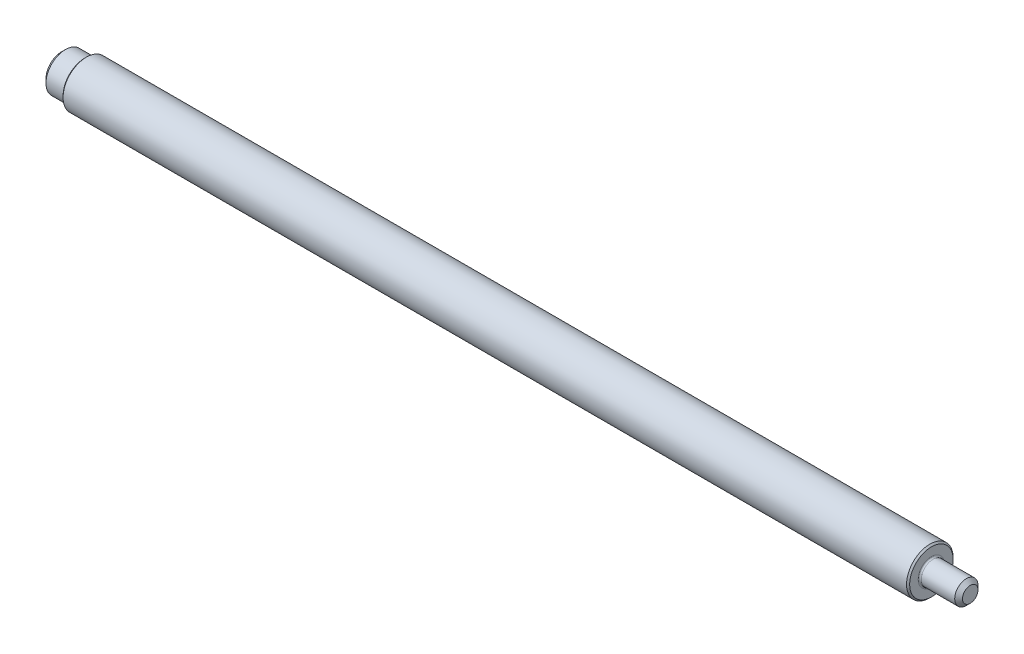
ISO-10303-21;
HEADER;
FILE_DESCRIPTION(('STEP AP214'),'2;1');
FILE_NAME('part.step','',(''),(''),'','','');
FILE_SCHEMA(('AUTOMOTIVE_DESIGN { 1 0 10303 214 1 1 1 1 }'));
ENDSEC;
DATA;
#1=APPLICATION_CONTEXT('core data for automotive mechanical design processes');
#2=APPLICATION_PROTOCOL_DEFINITION('international standard','automotive_design',2000,#1);
#3=PRODUCT_CONTEXT('',#1,'mechanical');
#4=PRODUCT('Part','Part','',(#3));
#5=PRODUCT_RELATED_PRODUCT_CATEGORY('part','',(#4));
#6=PRODUCT_DEFINITION_FORMATION('','',#4);
#7=PRODUCT_DEFINITION_CONTEXT('part definition',#1,'design');
#8=PRODUCT_DEFINITION('design','',#6,#7);
#9=PRODUCT_DEFINITION_SHAPE('','',#8);
#10=(LENGTH_UNIT() NAMED_UNIT(*) SI_UNIT(.MILLI.,.METRE.));
#11=(NAMED_UNIT(*) PLANE_ANGLE_UNIT() SI_UNIT($,.RADIAN.));
#12=(NAMED_UNIT(*) SI_UNIT($,.STERADIAN.) SOLID_ANGLE_UNIT());
#13=UNCERTAINTY_MEASURE_WITH_UNIT(LENGTH_MEASURE(1.E-05),#10,'distance_accuracy_value','');
#14=(GEOMETRIC_REPRESENTATION_CONTEXT(3) GLOBAL_UNCERTAINTY_ASSIGNED_CONTEXT((#13)) GLOBAL_UNIT_ASSIGNED_CONTEXT((#10,
#11,#12)) REPRESENTATION_CONTEXT('',''));
#15=CARTESIAN_POINT('',(0.,0.,0.));
#16=DIRECTION('',(0.,0.,1.));
#17=DIRECTION('',(1.,0.,0.));
#18=AXIS2_PLACEMENT_3D('',#15,#16,#17);
#19=CARTESIAN_POINT('',(117.,1.5,0.));
#20=DIRECTION('',(-1.,0.,0.));
#21=DIRECTION('',(0.,0.,1.));
#22=AXIS2_PLACEMENT_3D('',#19,#20,#21);
#23=PLANE('',#22);
#24=CARTESIAN_POINT('',(117.,0.,0.));
#25=DIRECTION('',(-1.,0.,0.));
#26=DIRECTION('',(0.,0.,1.));
#27=AXIS2_PLACEMENT_3D('',#24,#25,#26);
#28=CIRCLE('',#27,0.999999999999987);
#29=CARTESIAN_POINT('',(117.,0.,0.999999999999987));
#30=VERTEX_POINT('',#29);
#31=EDGE_CURVE('E46',#30,#30,#28,.F.);
#32=ORIENTED_EDGE('',*,*,#31,.T.);
#33=EDGE_LOOP('',(#32));
#34=FACE_BOUND('',#33,.T.);
#35=ADVANCED_FACE('F35',(#34),#23,.F.);
#36=CARTESIAN_POINT('',(0.,0.,0.));
#37=DIRECTION('',(-1.,0.,0.));
#38=DIRECTION('',(0.,0.,1.));
#39=AXIS2_PLACEMENT_3D('',#36,#37,#38);
#40=CYLINDRICAL_SURFACE('',#39,1.5);
#41=CARTESIAN_POINT('',(112.2,0.,0.));
#42=DIRECTION('',(-1.,0.,0.));
#43=DIRECTION('',(0.,0.,1.));
#44=AXIS2_PLACEMENT_3D('',#41,#42,#43);
#45=CIRCLE('',#44,1.5);
#46=CARTESIAN_POINT('',(112.2,0.,1.5));
#47=VERTEX_POINT('',#46);
#48=EDGE_CURVE('E10',#47,#47,#45,.F.);
#49=ORIENTED_EDGE('',*,*,#48,.T.);
#50=EDGE_LOOP('',(#49));
#51=FACE_BOUND('',#50,.T.);
#52=CARTESIAN_POINT('',(116.5,0.,0.));
#53=DIRECTION('',(-1.,0.,0.));
#54=DIRECTION('',(0.,0.,1.));
#55=AXIS2_PLACEMENT_3D('',#52,#53,#54);
#56=CIRCLE('',#55,1.5);
#57=CARTESIAN_POINT('',(116.5,0.,1.5));
#58=VERTEX_POINT('',#57);
#59=EDGE_CURVE('E50',#58,#58,#56,.T.);
#60=ORIENTED_EDGE('',*,*,#59,.T.);
#61=EDGE_LOOP('',(#60));
#62=FACE_BOUND('',#61,.T.);
#63=ADVANCED_FACE('F95',(#51,#62),#40,.T.);
#64=CARTESIAN_POINT('',(112.,1.5,0.));
#65=DIRECTION('',(-1.,0.,0.));
#66=DIRECTION('',(0.,0.,1.));
#67=AXIS2_PLACEMENT_3D('',#64,#65,#66);
#68=PLANE('',#67);
#69=CARTESIAN_POINT('',(112.,0.,0.));
#70=DIRECTION('',(-1.,0.,0.));
#71=DIRECTION('',(0.,0.,1.));
#72=AXIS2_PLACEMENT_3D('',#69,#70,#71);
#73=CIRCLE('',#72,1.7);
#74=CARTESIAN_POINT('',(112.,0.,1.7));
#75=VERTEX_POINT('',#74);
#76=EDGE_CURVE('E42',#75,#75,#73,.T.);
#77=ORIENTED_EDGE('',*,*,#76,.T.);
#78=EDGE_LOOP('',(#77));
#79=FACE_BOUND('',#78,.T.);
#80=CARTESIAN_POINT('',(112.,0.,0.));
#81=DIRECTION('',(-1.,0.,0.));
#82=DIRECTION('',(0.,0.,1.));
#83=AXIS2_PLACEMENT_3D('',#80,#81,#82);
#84=CIRCLE('',#83,2.80000000000002);
#85=CARTESIAN_POINT('',(112.,0.,2.80000000000002));
#86=VERTEX_POINT('',#85);
#87=EDGE_CURVE('E67',#86,#86,#84,.F.);
#88=ORIENTED_EDGE('',*,*,#87,.T.);
#89=EDGE_LOOP('',(#88));
#90=FACE_BOUND('',#89,.T.);
#91=ADVANCED_FACE('F91',(#79,#90),#68,.F.);
#92=CARTESIAN_POINT('',(0.,0.,0.));
#93=DIRECTION('',(-1.,0.,0.));
#94=DIRECTION('',(0.,0.,1.));
#95=AXIS2_PLACEMENT_3D('',#92,#93,#94);
#96=CYLINDRICAL_SURFACE('',#95,3.);
#97=CARTESIAN_POINT('',(3.20000000000001,0.,0.));
#98=DIRECTION('',(1.,0.,0.));
#99=DIRECTION('',(0.,0.,-1.));
#100=AXIS2_PLACEMENT_3D('',#97,#98,#99);
#101=CIRCLE('',#100,3.);
#102=CARTESIAN_POINT('',(3.20000000000001,0.,-3.));
#103=VERTEX_POINT('',#102);
#104=EDGE_CURVE('E61',#103,#103,#101,.T.);
#105=ORIENTED_EDGE('',*,*,#104,.T.);
#106=EDGE_LOOP('',(#105));
#107=FACE_BOUND('',#106,.T.);
#108=CARTESIAN_POINT('',(111.8,0.,0.));
#109=DIRECTION('',(-1.,0.,0.));
#110=DIRECTION('',(0.,0.,1.));
#111=AXIS2_PLACEMENT_3D('',#108,#109,#110);
#112=CIRCLE('',#111,3.);
#113=CARTESIAN_POINT('',(111.8,0.,3.));
#114=VERTEX_POINT('',#113);
#115=EDGE_CURVE('E70',#114,#114,#112,.T.);
#116=ORIENTED_EDGE('',*,*,#115,.T.);
#117=EDGE_LOOP('',(#116));
#118=FACE_BOUND('',#117,.T.);
#119=ADVANCED_FACE('F81',(#107,#118),#96,.T.);
#120=CARTESIAN_POINT('',(3.,2.99999999999999,0.));
#121=DIRECTION('',(1.,0.,0.));
#122=DIRECTION('',(0.,0.,-1.));
#123=AXIS2_PLACEMENT_3D('',#120,#121,#122);
#124=PLANE('',#123);
#125=CARTESIAN_POINT('',(3.,0.,0.));
#126=DIRECTION('',(1.,0.,0.));
#127=DIRECTION('',(0.,0.,-1.));
#128=AXIS2_PLACEMENT_3D('',#125,#126,#127);
#129=CIRCLE('',#128,2.8);
#130=CARTESIAN_POINT('',(3.,0.,-2.8));
#131=VERTEX_POINT('',#130);
#132=EDGE_CURVE('E64',#131,#131,#129,.F.);
#133=ORIENTED_EDGE('',*,*,#132,.T.);
#134=EDGE_LOOP('',(#133));
#135=FACE_BOUND('',#134,.T.);
#136=CARTESIAN_POINT('',(3.,0.,0.));
#137=DIRECTION('',(-1.,0.,0.));
#138=DIRECTION('',(0.,0.,1.));
#139=AXIS2_PLACEMENT_3D('',#136,#137,#138);
#140=CIRCLE('',#139,2.5);
#141=CARTESIAN_POINT('',(3.,0.,2.5));
#142=VERTEX_POINT('',#141);
#143=EDGE_CURVE('E73',#142,#142,#140,.T.);
#144=ORIENTED_EDGE('',*,*,#143,.F.);
#145=EDGE_LOOP('',(#144));
#146=FACE_BOUND('',#145,.T.);
#147=ADVANCED_FACE('F79',(#135,#146),#124,.F.);
#148=CARTESIAN_POINT('',(0.,0.,0.));
#149=DIRECTION('',(-1.,0.,0.));
#150=DIRECTION('',(0.,0.,1.));
#151=AXIS2_PLACEMENT_3D('',#148,#149,#150);
#152=CYLINDRICAL_SURFACE('',#151,2.5);
#153=CARTESIAN_POINT('',(0.500000000000005,0.,0.));
#154=DIRECTION('',(1.,0.,0.));
#155=DIRECTION('',(0.,0.,-1.));
#156=AXIS2_PLACEMENT_3D('',#153,#154,#155);
#157=CIRCLE('',#156,2.5);
#158=CARTESIAN_POINT('',(0.500000000000005,0.,-2.5));
#159=VERTEX_POINT('',#158);
#160=EDGE_CURVE('E55',#159,#159,#157,.T.);
#161=ORIENTED_EDGE('',*,*,#160,.T.);
#162=EDGE_LOOP('',(#161));
#163=FACE_BOUND('',#162,.T.);
#164=ORIENTED_EDGE('',*,*,#143,.T.);
#165=EDGE_LOOP('',(#164));
#166=FACE_BOUND('',#165,.T.);
#167=ADVANCED_FACE('F77',(#163,#166),#152,.T.);
#168=CARTESIAN_POINT('',(0.,2.5,0.));
#169=DIRECTION('',(1.,0.,0.));
#170=DIRECTION('',(0.,0.,-1.));
#171=AXIS2_PLACEMENT_3D('',#168,#169,#170);
#172=PLANE('',#171);
#173=CARTESIAN_POINT('',(0.,0.,0.));
#174=DIRECTION('',(1.,0.,0.));
#175=DIRECTION('',(0.,0.,-1.));
#176=AXIS2_PLACEMENT_3D('',#173,#174,#175);
#177=CIRCLE('',#176,2.);
#178=CARTESIAN_POINT('',(0.,0.,-2.));
#179=VERTEX_POINT('',#178);
#180=EDGE_CURVE('E58',#179,#179,#177,.F.);
#181=ORIENTED_EDGE('',*,*,#180,.T.);
#182=EDGE_LOOP('',(#181));
#183=FACE_BOUND('',#182,.T.);
#184=ADVANCED_FACE('F88',(#183),#172,.F.);
#185=CARTESIAN_POINT('',(111.8,0.,0.));
#186=DIRECTION('',(-1.,0.,0.));
#187=DIRECTION('',(0.,0.,1.));
#188=AXIS2_PLACEMENT_3D('',#185,#186,#187);
#189=CONICAL_SURFACE('',#188,3.,0.785398163397474);
#190=ORIENTED_EDGE('',*,*,#87,.F.);
#191=EDGE_LOOP('',(#190));
#192=FACE_BOUND('',#191,.T.);
#193=ORIENTED_EDGE('',*,*,#115,.F.);
#194=EDGE_LOOP('',(#193));
#195=FACE_BOUND('',#194,.T.);
#196=ADVANCED_FACE('F104',(#192,#195),#189,.T.);
#197=CARTESIAN_POINT('',(3.,0.,0.));
#198=DIRECTION('',(1.,0.,0.));
#199=DIRECTION('',(0.,0.,-1.));
#200=AXIS2_PLACEMENT_3D('',#197,#198,#199);
#201=CONICAL_SURFACE('',#200,2.8,0.785398163397443);
#202=ORIENTED_EDGE('',*,*,#104,.F.);
#203=EDGE_LOOP('',(#202));
#204=FACE_BOUND('',#203,.T.);
#205=ORIENTED_EDGE('',*,*,#132,.F.);
#206=EDGE_LOOP('',(#205));
#207=FACE_BOUND('',#206,.T.);
#208=ADVANCED_FACE('F107',(#204,#207),#201,.T.);
#209=CARTESIAN_POINT('',(0.,0.,0.));
#210=DIRECTION('',(1.,0.,0.));
#211=DIRECTION('',(0.,0.,-1.));
#212=AXIS2_PLACEMENT_3D('',#209,#210,#211);
#213=CONICAL_SURFACE('',#212,2.,0.78539816339744);
#214=ORIENTED_EDGE('',*,*,#160,.F.);
#215=EDGE_LOOP('',(#214));
#216=FACE_BOUND('',#215,.T.);
#217=ORIENTED_EDGE('',*,*,#180,.F.);
#218=EDGE_LOOP('',(#217));
#219=FACE_BOUND('',#218,.T.);
#220=ADVANCED_FACE('F111',(#216,#219),#213,.T.);
#221=CARTESIAN_POINT('',(116.5,0.,0.));
#222=DIRECTION('',(-1.,0.,0.));
#223=DIRECTION('',(0.,0.,1.));
#224=AXIS2_PLACEMENT_3D('',#221,#222,#223);
#225=CONICAL_SURFACE('',#224,1.5,0.785398163397461);
#226=ORIENTED_EDGE('',*,*,#31,.F.);
#227=EDGE_LOOP('',(#226));
#228=FACE_BOUND('',#227,.T.);
#229=ORIENTED_EDGE('',*,*,#59,.F.);
#230=EDGE_LOOP('',(#229));
#231=FACE_BOUND('',#230,.T.);
#232=ADVANCED_FACE('F114',(#228,#231),#225,.T.);
#233=CARTESIAN_POINT('',(112.2,0.,0.));
#234=DIRECTION('',(-1.,0.,0.));
#235=DIRECTION('',(0.,0.,1.));
#236=AXIS2_PLACEMENT_3D('',#233,#234,#235);
#237=TOROIDAL_SURFACE('',#236,1.7,0.2);
#238=ORIENTED_EDGE('',*,*,#48,.F.);
#239=EDGE_LOOP('',(#238));
#240=FACE_BOUND('',#239,.T.);
#241=ORIENTED_EDGE('',*,*,#76,.F.);
#242=EDGE_LOOP('',(#241));
#243=FACE_BOUND('',#242,.T.);
#244=ADVANCED_FACE('F37',(#240,#243),#237,.F.);
#245=CLOSED_SHELL('',(#35,#63,#91,#119,#147,#167,#184,#196,#208,#220,#232,#244));
#246=MANIFOLD_SOLID_BREP('B2',#245);
#247=ADVANCED_BREP_SHAPE_REPRESENTATION('',(#18,#246),#14);
#248=SHAPE_DEFINITION_REPRESENTATION(#9,#247);
ENDSEC;
END-ISO-10303-21;
